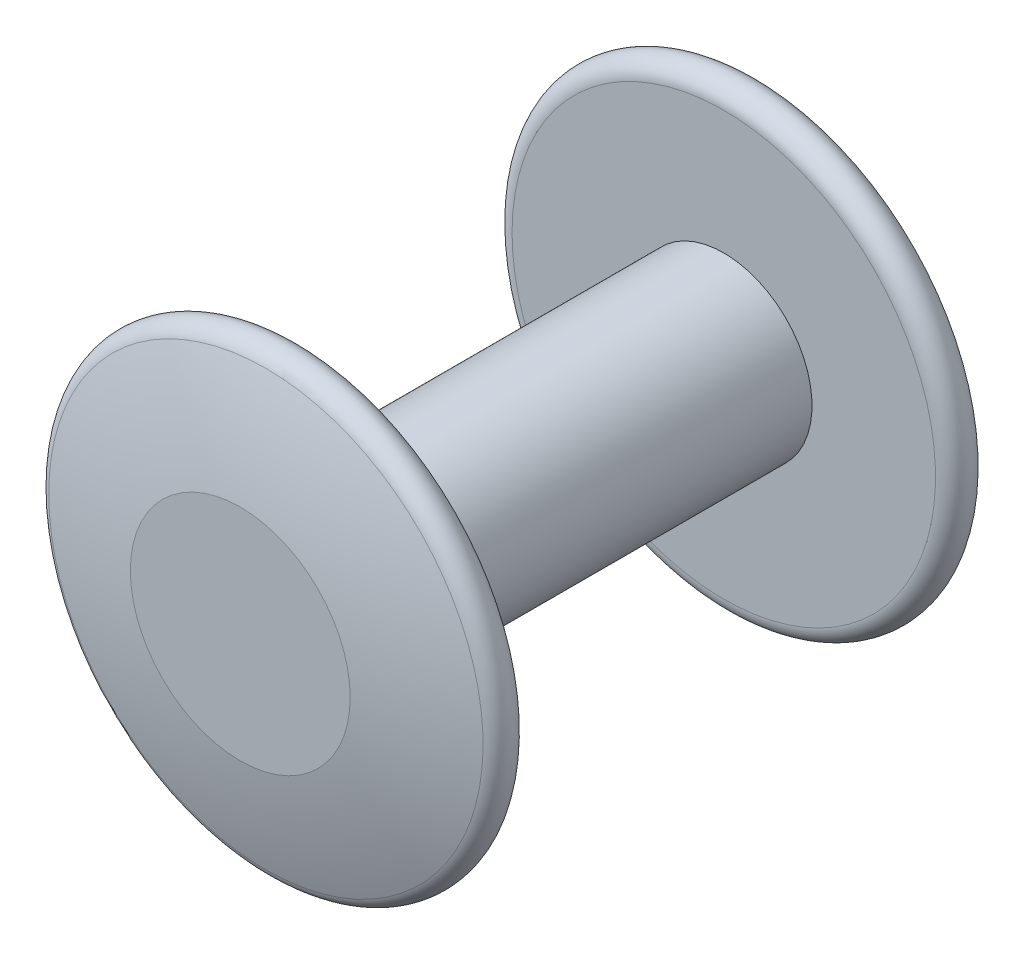
ISO-10303-21;
HEADER;
FILE_DESCRIPTION(('STEP AP214'),'2;1');
FILE_NAME('part.step','',(''),(''),'','','');
FILE_SCHEMA(('AUTOMOTIVE_DESIGN { 1 0 10303 214 1 1 1 1 }'));
ENDSEC;
DATA;
#1=APPLICATION_CONTEXT('core data for automotive mechanical design processes');
#2=APPLICATION_PROTOCOL_DEFINITION('international standard','automotive_design',2000,#1);
#3=PRODUCT_CONTEXT('',#1,'mechanical');
#4=PRODUCT('Part','Part','',(#3));
#5=PRODUCT_RELATED_PRODUCT_CATEGORY('part','',(#4));
#6=PRODUCT_DEFINITION_FORMATION('','',#4);
#7=PRODUCT_DEFINITION_CONTEXT('part definition',#1,'design');
#8=PRODUCT_DEFINITION('design','',#6,#7);
#9=PRODUCT_DEFINITION_SHAPE('','',#8);
#10=(LENGTH_UNIT() NAMED_UNIT(*) SI_UNIT(.MILLI.,.METRE.));
#11=(NAMED_UNIT(*) PLANE_ANGLE_UNIT() SI_UNIT($,.RADIAN.));
#12=(NAMED_UNIT(*) SI_UNIT($,.STERADIAN.) SOLID_ANGLE_UNIT());
#13=UNCERTAINTY_MEASURE_WITH_UNIT(LENGTH_MEASURE(1.E-05),#10,'distance_accuracy_value','');
#14=(GEOMETRIC_REPRESENTATION_CONTEXT(3) GLOBAL_UNCERTAINTY_ASSIGNED_CONTEXT((#13)) GLOBAL_UNIT_ASSIGNED_CONTEXT((#10,
#11,#12)) REPRESENTATION_CONTEXT('',''));
#15=CARTESIAN_POINT('',(0.,0.,0.));
#16=DIRECTION('',(0.,0.,1.));
#17=DIRECTION('',(1.,0.,0.));
#18=AXIS2_PLACEMENT_3D('',#15,#16,#17);
#19=CARTESIAN_POINT('',(0.,0.,6.5));
#20=DIRECTION('',(0.,0.,-1.));
#21=DIRECTION('',(-1.,0.,0.));
#22=AXIS2_PLACEMENT_3D('',#19,#20,#21);
#23=TOROIDAL_SURFACE('',#22,6.,0.500000000000003);
#24=CARTESIAN_POINT('',(0.,0.,6.));
#25=DIRECTION('',(0.,0.,-1.));
#26=DIRECTION('',(-1.,0.,0.));
#27=AXIS2_PLACEMENT_3D('',#24,#25,#26);
#28=CIRCLE('',#27,6.);
#29=CARTESIAN_POINT('',(-6.,0.,6.));
#30=VERTEX_POINT('',#29);
#31=EDGE_CURVE('E62',#30,#30,#28,.T.);
#32=ORIENTED_EDGE('',*,*,#31,.F.);
#33=EDGE_LOOP('',(#32));
#34=FACE_BOUND('',#33,.T.);
#35=CARTESIAN_POINT('',(0.,0.,6.97574295680204));
#36=DIRECTION('',(0.,0.,-1.));
#37=DIRECTION('',(-1.,0.,0.));
#38=AXIS2_PLACEMENT_3D('',#35,#36,#37);
#39=CIRCLE('',#38,6.15384615384616);
#40=CARTESIAN_POINT('',(0.,6.15384615384615,6.97574295680205));
#41=VERTEX_POINT('',#40);
#42=EDGE_CURVE('E10',#41,#41,#39,.T.);
#43=ORIENTED_EDGE('',*,*,#42,.T.);
#44=EDGE_LOOP('',(#43));
#45=FACE_BOUND('',#44,.T.);
#46=ADVANCED_FACE('F34',(#34,#45),#23,.T.);
#47=CARTESIAN_POINT('',(0.,0.,-12.0539753152795));
#48=DIRECTION('',(0.,0.,-1.));
#49=DIRECTION('',(0.,1.,0.));
#50=AXIS2_PLACEMENT_3D('',#47,#48,#49);
#51=SPHERICAL_SURFACE('',#50,20.);
#52=CARTESIAN_POINT('',(0.,0.,7.70196512603628));
#53=DIRECTION('',(0.,0.,-1.));
#54=DIRECTION('',(-1.,0.,0.));
#55=AXIS2_PLACEMENT_3D('',#52,#53,#54);
#56=CIRCLE('',#55,3.11493455455888);
#57=CARTESIAN_POINT('',(0.,3.11493455455886,7.70196512603628));
#58=VERTEX_POINT('',#57);
#59=EDGE_CURVE('E40',#58,#58,#56,.T.);
#60=CARTESIAN_POINT('',(0.,6.15384615384615,6.97574295680205));
#61=CARTESIAN_POINT('',(0.,6.12284686966029,6.98576753187389));
#62=CARTESIAN_POINT('',(0.,6.0918230901198,6.99571635922609));
#63=CARTESIAN_POINT('',(0.,6.0297272821646,7.01546228374603));
#64=CARTESIAN_POINT('',(0.,5.99865525374988,7.02525938091376));
#65=CARTESIAN_POINT('',(0.,5.93646368988123,7.04470161031953));
#66=CARTESIAN_POINT('',(0.,5.90534415442731,7.05434674255758));
#67=CARTESIAN_POINT('',(0.,5.84305831975862,7.07348481195905));
#68=CARTESIAN_POINT('',(0.,5.81189202054386,7.08297774912248));
#69=CARTESIAN_POINT('',(0.,5.74951340266598,7.10181120160441));
#70=CARTESIAN_POINT('',(0.,5.71830108400287,7.11115171692292));
#71=CARTESIAN_POINT('',(0.,5.65583117266198,7.12968010265464));
#72=CARTESIAN_POINT('',(0.,5.62457357998421,7.13886797306785));
#73=CARTESIAN_POINT('',(0.,5.56201386712304,7.15709084955549));
#74=CARTESIAN_POINT('',(0.,5.53071174693964,7.1661258556299));
#75=CARTESIAN_POINT('',(0.,5.46806372664126,7.18404278766223));
#76=CARTESIAN_POINT('',(0.,5.43671782652628,7.19292471362014));
#77=CARTESIAN_POINT('',(0.,5.37398299498392,7.21053527329634));
#78=CARTESIAN_POINT('',(0.,5.34259406355655,7.21926390701464));
#79=CARTESIAN_POINT('',(0.,5.27977391903642,7.23656767374985));
#80=CARTESIAN_POINT('',(0.,5.24834270594366,7.24514280676676));
#81=CARTESIAN_POINT('',(0.,5.18543874874951,7.26213936730337));
#82=CARTESIAN_POINT('',(0.,5.15396600464813,7.27056079482306));
#83=CARTESIAN_POINT('',(0.,5.09097973708539,7.28724974324025));
#84=CARTESIAN_POINT('',(0.,5.05946621362403,7.29551726413775));
#85=CARTESIAN_POINT('',(0.,4.99639913996388,7.31189820186128));
#86=CARTESIAN_POINT('',(0.,4.96484558976509,7.32001161868731));
#87=CARTESIAN_POINT('',(0.,4.90169921620857,7.336084154499));
#88=CARTESIAN_POINT('',(0.,4.87010639285085,7.34404327348466));
#89=CARTESIAN_POINT('',(0.,4.80688222749289,7.35980702353174));
#90=CARTESIAN_POINT('',(0.,4.77525088549266,7.36761165459317));
#91=CARTESIAN_POINT('',(0.,4.71195043828606,7.38306624239749));
#92=CARTESIAN_POINT('',(0.,4.68028133307969,7.39071619914038));
#93=CARTESIAN_POINT('',(0.,4.61690611579904,7.40586125560732));
#94=CARTESIAN_POINT('',(0.,4.58520000372476,7.41335635533137));
#95=CARTESIAN_POINT('',(0.,4.52175152993034,7.42819151875873));
#96=CARTESIAN_POINT('',(0.,4.49000916821021,7.43553158246203));
#97=CARTESIAN_POINT('',(0.,4.42648895321188,7.45005649854863));
#98=CARTESIAN_POINT('',(0.,4.39471109993368,7.45724135093192));
#99=CARTESIAN_POINT('',(0.,4.33112066075463,7.47145567278606));
#100=CARTESIAN_POINT('',(0.,4.29930807485379,7.47848514225691));
#101=CARTESIAN_POINT('',(0.,4.23564893019436,7.49238853040468));
#102=CARTESIAN_POINT('',(0.,4.20380237143579,7.49926244908161));
#103=CARTESIAN_POINT('',(0.,4.14007604163718,7.51285457147498));
#104=CARTESIAN_POINT('',(0.,4.10819627059715,7.51957277519143));
#105=CARTESIAN_POINT('',(0.,4.04440427760511,7.53285330721618));
#106=CARTESIAN_POINT('',(0.,4.0124920556531,7.53941563552447));
#107=CARTESIAN_POINT('',(0.,3.94863592298157,7.55238426000796));
#108=CARTESIAN_POINT('',(0.,3.91669201226206,7.55879055618314));
#109=CARTESIAN_POINT('',(0.,3.85277326495681,7.57144696340179));
#110=CARTESIAN_POINT('',(0.,3.82079842837107,7.57769707444525));
#111=CARTESIAN_POINT('',(0.,3.75681859297329,7.59004096213229));
#112=CARTESIAN_POINT('',(0.,3.72481359416125,7.59613473877588));
#113=CARTESIAN_POINT('',(0.,3.66077419867091,7.6081658121273));
#114=CARTESIAN_POINT('',(0.,3.62873980199261,7.61410310883513));
#115=CARTESIAN_POINT('',(0.,3.56464237583274,7.62582108052149));
#116=CARTESIAN_POINT('',(0.,3.53257934635118,7.63160175550002));
#117=CARTESIAN_POINT('',(0.,3.46842542032843,7.64300634565539));
#118=CARTESIAN_POINT('',(0.,3.43633452378726,7.64863026083223));
#119=CARTESIAN_POINT('',(0.,3.37212563006624,7.65972119712786));
#120=CARTESIAN_POINT('',(0.,3.3400076328864,7.66518821824666));
#121=CARTESIAN_POINT('',(0.,3.2757453049124,7.67596523564741));
#122=CARTESIAN_POINT('',(0.,3.24360097411823,7.68127523192936));
#123=CARTESIAN_POINT('',(0.,3.17928674673243,7.69173807363344));
#124=CARTESIAN_POINT('',(0.,3.1471168501408,7.69689091905557));
#125=CARTESIAN_POINT('',(0.,3.11493455455886,7.70196512603628));
#126=B_SPLINE_CURVE_WITH_KNOTS('',3,(#60,#61,#62,#63,#64,#65,#66,#67,#68,#69,#70,#71,#72,#73,
#74,#75,#76,#77,#78,#79,#80,#81,#82,#83,#84,#85,#86,#87,#88,#89,#90,#91,#92,#93,#94,#95,#96,#97,
#98,#99,#100,#101,#102,#103,#104,#105,#106,#107,#108,#109,#110,#111,#112,#113,#114,#115,#116,
#117,#118,#119,#120,#121,#122,#123,#124,#125),.UNSPECIFIED.,.F.,.F.,(4,2,2,2,2,2,2,2,2,2,2,2,2,
2,2,2,2,2,2,2,2,2,2,2,2,2,2,2,2,2,2,2,4),(0.,0.0977395033453757,0.195479006690751,
0.293218510036133,0.39095801338151,0.488697516726886,0.586437020072269,0.684176523417645,
0.781916026763021,0.879655530108399,0.977395033453775,1.07513453679916,1.17287404014453,
1.27061354348991,1.36835304683529,1.46609255018067,1.56383205352605,1.66157155687142,
1.7593110602168,1.85705056356218,1.95479006690756,2.05252957025293,2.15026907359831,
2.24800857694369,2.34574808028907,2.44348758363445,2.54122708697982,2.6389665903252,
2.73670609367058,2.83444559701596,2.93218510036134,3.02992460370671,3.12766410705209),.UNSPECIFIED.);
#127=EDGE_CURVE('BSEAM69',#41,#58,#126,.T.);
#128=ORIENTED_EDGE('',*,*,#42,.F.);
#129=ORIENTED_EDGE('',*,*,#59,.T.);
#130=ORIENTED_EDGE('',*,*,#127,.T.);
#131=ORIENTED_EDGE('',*,*,#127,.F.);
#132=EDGE_LOOP('',(#128,#130,#129,#131));
#133=FACE_BOUND('',#132,.T.);
#134=ADVANCED_FACE('F69',(#133),#51,.T.);
#135=CARTESIAN_POINT('',(0.,0.,7.70196512603628));
#136=DIRECTION('',(0.,0.,1.));
#137=DIRECTION('',(1.,0.,0.));
#138=AXIS2_PLACEMENT_3D('',#135,#136,#137);
#139=PLANE('',#138);
#140=ORIENTED_EDGE('',*,*,#59,.F.);
#141=EDGE_LOOP('',(#140));
#142=FACE_BOUND('',#141,.T.);
#143=ADVANCED_FACE('F73',(#142),#139,.T.);
#144=CARTESIAN_POINT('',(0.,0.,-7.70196512603628));
#145=DIRECTION('',(0.,0.,-1.));
#146=DIRECTION('',(-1.,0.,0.));
#147=AXIS2_PLACEMENT_3D('',#144,#145,#146);
#148=PLANE('',#147);
#149=CARTESIAN_POINT('',(0.,0.,-7.70196512603628));
#150=DIRECTION('',(0.,0.,-1.));
#151=DIRECTION('',(-1.,0.,0.));
#152=AXIS2_PLACEMENT_3D('',#149,#150,#151);
#153=CIRCLE('',#152,3.11493455455888);
#154=CARTESIAN_POINT('',(0.,3.11493455455888,-7.70196512603628));
#155=VERTEX_POINT('',#154);
#156=EDGE_CURVE('E44',#155,#155,#153,.T.);
#157=ORIENTED_EDGE('',*,*,#156,.T.);
#158=EDGE_LOOP('',(#157));
#159=FACE_BOUND('',#158,.T.);
#160=ADVANCED_FACE('F78',(#159),#148,.T.);
#161=CARTESIAN_POINT('',(0.,0.,12.0539753152795));
#162=DIRECTION('',(0.,0.,-1.));
#163=DIRECTION('',(0.,1.,0.));
#164=AXIS2_PLACEMENT_3D('',#161,#162,#163);
#165=SPHERICAL_SURFACE('',#164,20.);
#166=CARTESIAN_POINT('',(0.,0.,-6.97574295680204));
#167=DIRECTION('',(0.,0.,-1.));
#168=DIRECTION('',(-1.,0.,0.));
#169=AXIS2_PLACEMENT_3D('',#166,#167,#168);
#170=CIRCLE('',#169,6.15384615384616);
#171=CARTESIAN_POINT('',(0.,6.15384615384616,-6.97574295680204));
#172=VERTEX_POINT('',#171);
#173=EDGE_CURVE('E48',#172,#172,#170,.T.);
#174=CARTESIAN_POINT('',(0.,6.15384615384616,-6.97574295680204));
#175=CARTESIAN_POINT('',(0.,6.1228468696603,-6.98576753187388));
#176=CARTESIAN_POINT('',(0.,6.09182309011981,-6.99571635922609));
#177=CARTESIAN_POINT('',(0.,6.02972728216461,-7.01546228374602));
#178=CARTESIAN_POINT('',(0.,5.99865525374989,-7.02525938091375));
#179=CARTESIAN_POINT('',(0.,5.93646368988124,-7.04470161031953));
#180=CARTESIAN_POINT('',(0.,5.90534415442732,-7.05434674255758));
#181=CARTESIAN_POINT('',(0.,5.84305831975863,-7.07348481195905));
#182=CARTESIAN_POINT('',(0.,5.81189202054387,-7.08297774912248));
#183=CARTESIAN_POINT('',(0.,5.749513402666,-7.10181120160441));
#184=CARTESIAN_POINT('',(0.,5.71830108400288,-7.11115171692291));
#185=CARTESIAN_POINT('',(0.,5.65583117266199,-7.12968010265463));
#186=CARTESIAN_POINT('',(0.,5.62457357998422,-7.13886797306785));
#187=CARTESIAN_POINT('',(0.,5.56201386712305,-7.15709084955548));
#188=CARTESIAN_POINT('',(0.,5.53071174693965,-7.1661258556299));
#189=CARTESIAN_POINT('',(0.,5.46806372664127,-7.18404278766223));
#190=CARTESIAN_POINT('',(0.,5.43671782652629,-7.19292471362014));
#191=CARTESIAN_POINT('',(0.,5.37398299498394,-7.21053527329634));
#192=CARTESIAN_POINT('',(0.,5.34259406355656,-7.21926390701463));
#193=CARTESIAN_POINT('',(0.,5.27977391903643,-7.23656767374984));
#194=CARTESIAN_POINT('',(0.,5.24834270594367,-7.24514280676676));
#195=CARTESIAN_POINT('',(0.,5.18543874874953,-7.26213936730337));
#196=CARTESIAN_POINT('',(0.,5.15396600464815,-7.27056079482306));
#197=CARTESIAN_POINT('',(0.,5.09097973708541,-7.28724974324025));
#198=CARTESIAN_POINT('',(0.,5.05946621362404,-7.29551726413775));
#199=CARTESIAN_POINT('',(0.,4.99639913996389,-7.31189820186128));
#200=CARTESIAN_POINT('',(0.,4.9648455897651,-7.32001161868731));
#201=CARTESIAN_POINT('',(0.,4.90169921620859,-7.33608415449899));
#202=CARTESIAN_POINT('',(0.,4.87010639285086,-7.34404327348465));
#203=CARTESIAN_POINT('',(0.,4.80688222749291,-7.35980702353174));
#204=CARTESIAN_POINT('',(0.,4.77525088549268,-7.36761165459317));
#205=CARTESIAN_POINT('',(0.,4.71195043828608,-7.38306624239748));
#206=CARTESIAN_POINT('',(0.,4.68028133307971,-7.39071619914037));
#207=CARTESIAN_POINT('',(0.,4.61690611579905,-7.40586125560731));
#208=CARTESIAN_POINT('',(0.,4.58520000372477,-7.41335635533136));
#209=CARTESIAN_POINT('',(0.,4.52175152993036,-7.42819151875872));
#210=CARTESIAN_POINT('',(0.,4.49000916821023,-7.43553158246203));
#211=CARTESIAN_POINT('',(0.,4.4264889532119,-7.45005649854863));
#212=CARTESIAN_POINT('',(0.,4.3947110999337,-7.45724135093191));
#213=CARTESIAN_POINT('',(0.,4.33112066075465,-7.47145567278606));
#214=CARTESIAN_POINT('',(0.,4.29930807485381,-7.47848514225691));
#215=CARTESIAN_POINT('',(0.,4.23564893019438,-7.49238853040468));
#216=CARTESIAN_POINT('',(0.,4.20380237143581,-7.4992624490816));
#217=CARTESIAN_POINT('',(0.,4.1400760416372,-7.51285457147498));
#218=CARTESIAN_POINT('',(0.,4.10819627059717,-7.51957277519143));
#219=CARTESIAN_POINT('',(0.,4.04440427760513,-7.53285330721617));
#220=CARTESIAN_POINT('',(0.,4.01249205565312,-7.53941563552447));
#221=CARTESIAN_POINT('',(0.,3.94863592298159,-7.55238426000795));
#222=CARTESIAN_POINT('',(0.,3.91669201226208,-7.55879055618314));
#223=CARTESIAN_POINT('',(0.,3.85277326495683,-7.57144696340178));
#224=CARTESIAN_POINT('',(0.,3.82079842837109,-7.57769707444524));
#225=CARTESIAN_POINT('',(0.,3.75681859297331,-7.59004096213228));
#226=CARTESIAN_POINT('',(0.,3.72481359416127,-7.59613473877587));
#227=CARTESIAN_POINT('',(0.,3.66077419867093,-7.60816581212729));
#228=CARTESIAN_POINT('',(0.,3.62873980199263,-7.61410310883513));
#229=CARTESIAN_POINT('',(0.,3.56464237583277,-7.62582108052149));
#230=CARTESIAN_POINT('',(0.,3.5325793463512,-7.63160175550002));
#231=CARTESIAN_POINT('',(0.,3.46842542032846,-7.64300634565538));
#232=CARTESIAN_POINT('',(0.,3.43633452378728,-7.64863026083222));
#233=CARTESIAN_POINT('',(0.,3.37212563006627,-7.65972119712786));
#234=CARTESIAN_POINT('',(0.,3.34000763288643,-7.66518821824666));
#235=CARTESIAN_POINT('',(0.,3.27574530491242,-7.67596523564741));
#236=CARTESIAN_POINT('',(0.,3.24360097411826,-7.68127523192936));
#237=CARTESIAN_POINT('',(0.,3.17928674673246,-7.69173807363344));
#238=CARTESIAN_POINT('',(0.,3.14711685014083,-7.69689091905556));
#239=CARTESIAN_POINT('',(0.,3.11493455455888,-7.70196512603628));
#240=B_SPLINE_CURVE_WITH_KNOTS('',3,(#174,#175,#176,#177,#178,#179,#180,#181,#182,#183,#184,
#185,#186,#187,#188,#189,#190,#191,#192,#193,#194,#195,#196,#197,#198,#199,#200,#201,#202,#203,
#204,#205,#206,#207,#208,#209,#210,#211,#212,#213,#214,#215,#216,#217,#218,#219,#220,#221,#222,
#223,#224,#225,#226,#227,#228,#229,#230,#231,#232,#233,#234,#235,#236,#237,#238,#239),
.UNSPECIFIED.,.F.,.F.,(4,2,2,2,2,2,2,2,2,2,2,2,2,2,2,2,2,2,2,2,2,2,2,2,2,2,2,2,2,2,2,2,4),(0.,
0.0977395033453776,0.195479006690754,0.293218510036131,0.390958013381509,0.488697516726889,
0.586437020072266,0.684176523417643,0.781916026763019,0.879655530108395,0.977395033453773,
1.07513453679915,1.17287404014453,1.27061354348991,1.36835304683528,1.46609255018066,
1.56383205352604,1.66157155687141,1.75931106021679,1.85705056356217,1.95479006690755,
2.05252957025293,2.1502690735983,2.24800857694368,2.34574808028906,2.44348758363443,
2.54122708697981,2.63896659032519,2.73670609367057,2.83444559701594,2.93218510036132,
3.0299246037067,3.12766410705207),.UNSPECIFIED.);
#241=EDGE_CURVE('BSEAM84',#172,#155,#240,.T.);
#242=ORIENTED_EDGE('',*,*,#173,.T.);
#243=ORIENTED_EDGE('',*,*,#156,.F.);
#244=ORIENTED_EDGE('',*,*,#241,.T.);
#245=ORIENTED_EDGE('',*,*,#241,.F.);
#246=EDGE_LOOP('',(#242,#244,#243,#245));
#247=FACE_BOUND('',#246,.T.);
#248=ADVANCED_FACE('F84',(#247),#165,.T.);
#249=CARTESIAN_POINT('',(0.,0.,-6.5));
#250=DIRECTION('',(0.,0.,-1.));
#251=DIRECTION('',(-1.,0.,0.));
#252=AXIS2_PLACEMENT_3D('',#249,#250,#251);
#253=TOROIDAL_SURFACE('',#252,6.,0.500000000000003);
#254=CARTESIAN_POINT('',(0.,0.,-6.));
#255=DIRECTION('',(0.,0.,-1.));
#256=DIRECTION('',(-1.,0.,0.));
#257=AXIS2_PLACEMENT_3D('',#254,#255,#256);
#258=CIRCLE('',#257,6.);
#259=CARTESIAN_POINT('',(-6.,0.,-6.));
#260=VERTEX_POINT('',#259);
#261=EDGE_CURVE('E53',#260,#260,#258,.T.);
#262=ORIENTED_EDGE('',*,*,#261,.T.);
#263=EDGE_LOOP('',(#262));
#264=FACE_BOUND('',#263,.T.);
#265=ORIENTED_EDGE('',*,*,#173,.F.);
#266=EDGE_LOOP('',(#265));
#267=FACE_BOUND('',#266,.T.);
#268=ADVANCED_FACE('F88',(#264,#267),#253,.T.);
#269=CARTESIAN_POINT('',(0.,0.,-6.));
#270=DIRECTION('',(0.,0.,1.));
#271=DIRECTION('',(1.,0.,0.));
#272=AXIS2_PLACEMENT_3D('',#269,#270,#271);
#273=PLANE('',#272);
#274=CARTESIAN_POINT('',(0.,0.,-6.));
#275=DIRECTION('',(0.,0.,-1.));
#276=DIRECTION('',(-1.,0.,0.));
#277=AXIS2_PLACEMENT_3D('',#274,#275,#276);
#278=CIRCLE('',#277,2.5);
#279=CARTESIAN_POINT('',(-2.5,0.,-6.));
#280=VERTEX_POINT('',#279);
#281=EDGE_CURVE('E56',#280,#280,#278,.T.);
#282=ORIENTED_EDGE('',*,*,#281,.T.);
#283=EDGE_LOOP('',(#282));
#284=FACE_BOUND('',#283,.T.);
#285=ORIENTED_EDGE('',*,*,#261,.F.);
#286=EDGE_LOOP('',(#285));
#287=FACE_BOUND('',#286,.T.);
#288=ADVANCED_FACE('F92',(#284,#287),#273,.T.);
#289=CARTESIAN_POINT('',(0.,0.,-7.94602468472053));
#290=DIRECTION('',(0.,0.,-1.));
#291=DIRECTION('',(-1.,0.,0.));
#292=AXIS2_PLACEMENT_3D('',#289,#290,#291);
#293=CYLINDRICAL_SURFACE('',#292,2.5);
#294=ORIENTED_EDGE('',*,*,#281,.F.);
#295=EDGE_LOOP('',(#294));
#296=FACE_BOUND('',#295,.T.);
#297=CARTESIAN_POINT('',(0.,0.,6.));
#298=DIRECTION('',(0.,0.,-1.));
#299=DIRECTION('',(-1.,0.,0.));
#300=AXIS2_PLACEMENT_3D('',#297,#298,#299);
#301=CIRCLE('',#300,2.5);
#302=CARTESIAN_POINT('',(-2.5,0.,6.));
#303=VERTEX_POINT('',#302);
#304=EDGE_CURVE('E59',#303,#303,#301,.T.);
#305=ORIENTED_EDGE('',*,*,#304,.T.);
#306=EDGE_LOOP('',(#305));
#307=FACE_BOUND('',#306,.T.);
#308=ADVANCED_FACE('F96',(#296,#307),#293,.T.);
#309=CARTESIAN_POINT('',(0.,0.,6.));
#310=DIRECTION('',(0.,0.,1.));
#311=DIRECTION('',(1.,0.,0.));
#312=AXIS2_PLACEMENT_3D('',#309,#310,#311);
#313=PLANE('',#312);
#314=ORIENTED_EDGE('',*,*,#304,.F.);
#315=EDGE_LOOP('',(#314));
#316=FACE_BOUND('',#315,.T.);
#317=ORIENTED_EDGE('',*,*,#31,.T.);
#318=EDGE_LOOP('',(#317));
#319=FACE_BOUND('',#318,.T.);
#320=ADVANCED_FACE('F66',(#316,#319),#313,.F.);
#321=CLOSED_SHELL('',(#46,#134,#143,#160,#248,#268,#288,#308,#320));
#322=MANIFOLD_SOLID_BREP('B2',#321);
#323=ADVANCED_BREP_SHAPE_REPRESENTATION('',(#18,#322),#14);
#324=SHAPE_DEFINITION_REPRESENTATION(#9,#323);
ENDSEC;
END-ISO-10303-21;
